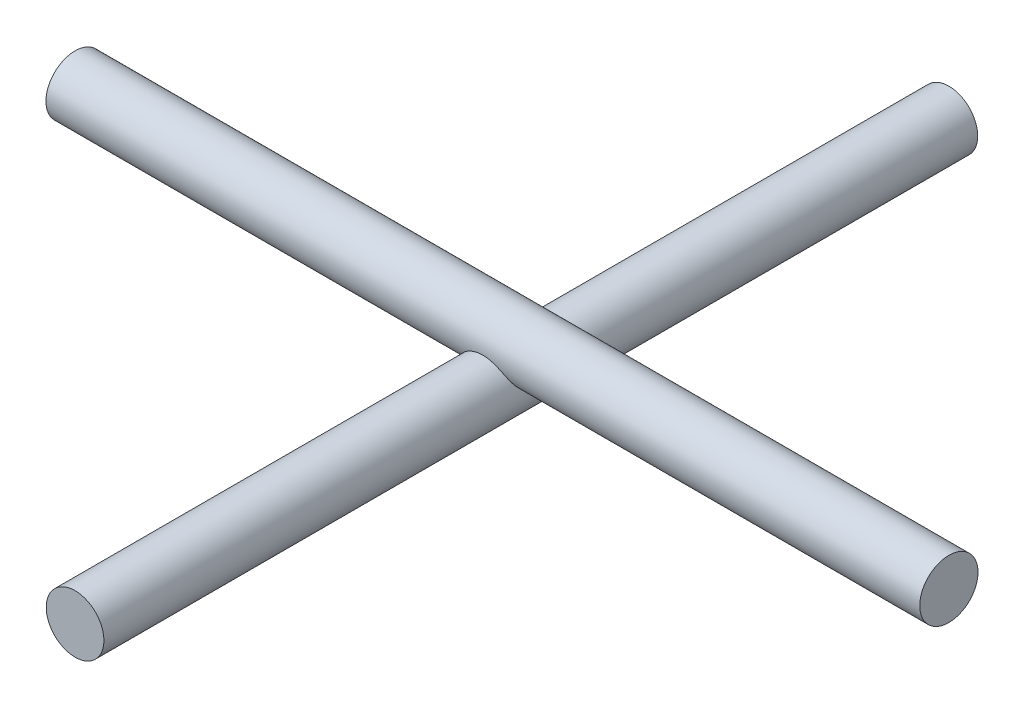
ISO-10303-21;
HEADER;
FILE_DESCRIPTION(('STEP AP214'),'2;1');
FILE_NAME('part.step','',(''),(''),'','','');
FILE_SCHEMA(('AUTOMOTIVE_DESIGN { 1 0 10303 214 1 1 1 1 }'));
ENDSEC;
DATA;
#1=APPLICATION_CONTEXT('core data for automotive mechanical design processes');
#2=APPLICATION_PROTOCOL_DEFINITION('international standard','automotive_design',2000,#1);
#3=PRODUCT_CONTEXT('',#1,'mechanical');
#4=PRODUCT('Part','Part','',(#3));
#5=PRODUCT_RELATED_PRODUCT_CATEGORY('part','',(#4));
#6=PRODUCT_DEFINITION_FORMATION('','',#4);
#7=PRODUCT_DEFINITION_CONTEXT('part definition',#1,'design');
#8=PRODUCT_DEFINITION('design','',#6,#7);
#9=PRODUCT_DEFINITION_SHAPE('','',#8);
#10=(LENGTH_UNIT() NAMED_UNIT(*) SI_UNIT(.MILLI.,.METRE.));
#11=(NAMED_UNIT(*) PLANE_ANGLE_UNIT() SI_UNIT($,.RADIAN.));
#12=(NAMED_UNIT(*) SI_UNIT($,.STERADIAN.) SOLID_ANGLE_UNIT());
#13=UNCERTAINTY_MEASURE_WITH_UNIT(LENGTH_MEASURE(1.E-05),#10,'distance_accuracy_value','');
#14=(GEOMETRIC_REPRESENTATION_CONTEXT(3) GLOBAL_UNCERTAINTY_ASSIGNED_CONTEXT((#13)) GLOBAL_UNIT_ASSIGNED_CONTEXT((#10,
#11,#12)) REPRESENTATION_CONTEXT('',''));
#15=CARTESIAN_POINT('',(0.,0.,0.));
#16=DIRECTION('',(0.,0.,1.));
#17=DIRECTION('',(1.,0.,0.));
#18=AXIS2_PLACEMENT_3D('',#15,#16,#17);
#19=CARTESIAN_POINT('',(0.,0.,-37.5));
#20=DIRECTION('',(0.,0.,1.));
#21=DIRECTION('',(1.,0.,0.));
#22=AXIS2_PLACEMENT_3D('',#19,#20,#21);
#23=CYLINDRICAL_SURFACE('',#22,2.475);
#24=CARTESIAN_POINT('',(0.,2.475,-2.49687304442977));
#25=CARTESIAN_POINT('',(-0.136825049366993,2.4749939060348,-2.49688150085582));
#26=CARTESIAN_POINT('',(-0.273836413663533,2.46360475615868,-2.49638265355391));
#27=CARTESIAN_POINT('',(-0.544283623429029,2.41831903638978,-2.49348983499042));
#28=CARTESIAN_POINT('',(-0.677710319039354,2.38436968621515,-2.49109141709474));
#29=CARTESIAN_POINT('',(-0.937213990908357,2.29478829043579,-2.48170694757631));
#30=CARTESIAN_POINT('',(-1.06328365680276,2.23913508662862,-2.47471641472239));
#31=CARTESIAN_POINT('',(-1.24360071469572,2.14097998508997,-2.4577196712458));
#32=CARTESIAN_POINT('',(-1.30225523022314,2.10580523157464,-2.45096645946464));
#33=CARTESIAN_POINT('',(-1.41618017067527,2.03093369955874,-2.43467330393503));
#34=CARTESIAN_POINT('',(-1.47145245468653,1.99123944021958,-2.42513490804704));
#35=CARTESIAN_POINT('',(-1.57584215453487,1.90959427833339,-2.40313295741082));
#36=CARTESIAN_POINT('',(-1.62512162963953,1.86781220234036,-2.39081176028972));
#37=CARTESIAN_POINT('',(-1.71968843089288,1.78112540489334,-2.36252448455092));
#38=CARTESIAN_POINT('',(-1.76497798056732,1.73622244794189,-2.34656045406855));
#39=CARTESIAN_POINT('',(-1.85117866867184,1.64400107978488,-2.31052163682664));
#40=CARTESIAN_POINT('',(-1.89209382985623,1.59668494797089,-2.2904506772387));
#41=CARTESIAN_POINT('',(-1.96929262512795,1.5004418887511,-2.24583904655907));
#42=CARTESIAN_POINT('',(-2.0055769817358,1.45151521413214,-2.22129907419797));
#43=CARTESIAN_POINT('',(-2.09833483864828,1.31657189087192,-2.14762154128585));
#44=CARTESIAN_POINT('',(-2.15000098323846,1.22977247137706,-2.09367734292665));
#45=CARTESIAN_POINT('',(-2.2390353199906,1.05908321140109,-1.97144734962398));
#46=CARTESIAN_POINT('',(-2.27640231100894,0.9751936158862,-1.90316035061641));
#47=CARTESIAN_POINT('',(-2.33723764595515,0.818361422242649,-1.75691555579531));
#48=CARTESIAN_POINT('',(-2.36125113443669,0.745097591136706,-1.67952430551205));
#49=CARTESIAN_POINT('',(-2.40017097572724,0.608179730554866,-1.51464611065477));
#50=CARTESIAN_POINT('',(-2.41507412714164,0.544529085084869,-1.42715563001109));
#51=CARTESIAN_POINT('',(-2.43950407769845,0.422740980930348,-1.23444642161153));
#52=CARTESIAN_POINT('',(-2.4483040326848,0.365879761933518,-1.12833066505226));
#53=CARTESIAN_POINT('',(-2.46095243565664,0.267919051664212,-0.908776781630666));
#54=CARTESIAN_POINT('',(-2.46479829636205,0.226827804131167,-0.79533486112155));
#55=CARTESIAN_POINT('',(-2.47026462079154,0.15745665756782,-0.54968963365143));
#56=CARTESIAN_POINT('',(-2.47156162544766,0.131313260770353,-0.416871307022782));
#57=CARTESIAN_POINT('',(-2.47299415732937,0.100781785295812,-0.148743731694326));
#58=CARTESIAN_POINT('',(-2.47312945432641,0.0963980190396963,-0.0134339945684399));
#59=CARTESIAN_POINT('',(-2.47257616638137,0.109748647278171,0.261338238199468));
#60=CARTESIAN_POINT('',(-2.47185551786278,0.128344953310946,0.400758969853668));
#61=CARTESIAN_POINT('',(-2.46798275759692,0.188668946517026,0.674623158014139));
#62=CARTESIAN_POINT('',(-2.46482965682168,0.230406040724722,0.809064566634093));
#63=CARTESIAN_POINT('',(-2.45574274550306,0.309237784754794,1.00365387422295));
#64=CARTESIAN_POINT('',(-2.45199065048915,0.338200088860001,1.06730687257856));
#65=CARTESIAN_POINT('',(-2.44246274634735,0.401276714309298,1.19183739464626));
#66=CARTESIAN_POINT('',(-2.43668790917943,0.435388556746222,1.25271623553588));
#67=CARTESIAN_POINT('',(-2.42250122616808,0.508423366981151,1.37118602236609));
#68=CARTESIAN_POINT('',(-2.41408964280531,0.547345855659373,1.42877729490057));
#69=CARTESIAN_POINT('',(-2.39397452376987,0.629522435350684,1.5401301231619));
#70=CARTESIAN_POINT('',(-2.38227299592273,0.672773874105841,1.59389398972077));
#71=CARTESIAN_POINT('',(-2.35587121661839,0.75988112335445,1.69352661037715));
#72=CARTESIAN_POINT('',(-2.3414356570802,0.803486358962307,1.73968435977016));
#73=CARTESIAN_POINT('',(-2.30866667394429,0.893289499594248,1.82786670738677));
#74=CARTESIAN_POINT('',(-2.29033551816493,0.939485884715026,1.86989368960444));
#75=CARTESIAN_POINT('',(-2.24937921196934,1.03370700478382,1.9494931564263));
#76=CARTESIAN_POINT('',(-2.22675801480763,1.08173002417984,1.9870696907146));
#77=CARTESIAN_POINT('',(-2.17695161069932,1.1787658358563,2.05759536455995));
#78=CARTESIAN_POINT('',(-2.14976704588209,1.2277784880292,2.0905451539681));
#79=CARTESIAN_POINT('',(-2.06916959171398,1.36157672084663,2.1739901506379));
#80=CARTESIAN_POINT('',(-2.01104298921558,1.44650080647529,2.21985693142635));
#81=CARTESIAN_POINT('',(-1.88113007657879,1.61184659605544,2.29825375467968));
#82=CARTESIAN_POINT('',(-1.80934072457202,1.69226729220414,2.33078082209935));
#83=CARTESIAN_POINT('',(-1.65537523159747,1.84301892664464,2.38395465374634));
#84=CARTESIAN_POINT('',(-1.57345834588338,1.9135309712599,2.40484394810856));
#85=CARTESIAN_POINT('',(-1.40001409835321,2.04386231683785,2.43828815594341));
#86=CARTESIAN_POINT('',(-1.30848326278656,2.10367773160829,2.45084004483087));
#87=CARTESIAN_POINT('',(-1.1069618627147,2.21700273782086,2.47123664430536));
#88=CARTESIAN_POINT('',(-0.996056933947301,2.26901191256973,2.47838002183871));
#89=CARTESIAN_POINT('',(-0.767611314605675,2.35613395857364,2.48846432211474));
#90=CARTESIAN_POINT('',(-0.65006751178966,2.39123883055066,2.49140325656858));
#91=CARTESIAN_POINT('',(-0.39848076111624,2.44644747548181,2.49545353316423));
#92=CARTESIAN_POINT('',(-0.264000270643142,2.46459198434734,2.49634089135644));
#93=CARTESIAN_POINT('',(0.00613414021151376,2.47868679205475,2.497064180538));
#94=CARTESIAN_POINT('',(0.141788286488773,2.47463271894238,2.49689990440957));
#95=CARTESIAN_POINT('',(0.414181223398607,2.44404710862294,2.49517974739997));
#96=CARTESIAN_POINT('',(0.550853022234931,2.41692104828272,2.49358699768031));
#97=CARTESIAN_POINT('',(0.817777126224013,2.34011074578863,2.48675226416997));
#98=CARTESIAN_POINT('',(0.948027115445714,2.29041843046641,2.48150897402558));
#99=CARTESIAN_POINT('',(1.13483449623115,2.2005738316687,2.46806525175896));
#100=CARTESIAN_POINT('',(1.19545982304176,2.16822725048849,2.46268531697002));
#101=CARTESIAN_POINT('',(1.31361253292526,2.09874543780415,2.44948935754015));
#102=CARTESIAN_POINT('',(1.37114139050164,2.06161251461753,2.44167450463329));
#103=CARTESIAN_POINT('',(1.48256428718372,1.98299672538466,2.42300145531856));
#104=CARTESIAN_POINT('',(1.53646080467559,1.9415168756939,2.4121453606064));
#105=CARTESIAN_POINT('',(1.64016390297796,1.85473857771963,2.38676089494275));
#106=CARTESIAN_POINT('',(1.68997104532823,1.80944065545852,2.37223302930806));
#107=CARTESIAN_POINT('',(1.78083430256718,1.71987155320211,2.34039062991054));
#108=CARTESIAN_POINT('',(1.82227479436775,1.67586256781319,2.32343518009209));
#109=CARTESIAN_POINT('',(1.90107032775758,1.58591625700247,2.28561013089839));
#110=CARTESIAN_POINT('',(1.93842599004319,1.53997922602233,2.26474112750587));
#111=CARTESIAN_POINT('',(2.00881592419877,1.4469558712191,2.21882260504872));
#112=CARTESIAN_POINT('',(2.0418535733415,1.39987048019112,2.19377638845705));
#113=CARTESIAN_POINT('',(2.10353879894642,1.30535078230881,2.13936093340693));
#114=CARTESIAN_POINT('',(2.13218679642165,1.25791650937377,2.10999211006161));
#115=CARTESIAN_POINT('',(2.20508522502552,1.12791781377905,2.02307677920414));
#116=CARTESIAN_POINT('',(2.24483769306437,1.04579990162751,1.96096656653636));
#117=CARTESIAN_POINT('',(2.31209183841771,0.887304666117711,1.82418788888984));
#118=CARTESIAN_POINT('',(2.33958983072755,0.810929075246357,1.74951565571141));
#119=CARTESIAN_POINT('',(2.3849027711362,0.666119062353311,1.58809308634355));
#120=CARTESIAN_POINT('',(2.40256407931124,0.597823093891606,1.50117631781898));
#121=CARTESIAN_POINT('',(2.43024482922206,0.472904729325865,1.31824052068492));
#122=CARTESIAN_POINT('',(2.44026097630848,0.416287373731096,1.22221758783022));
#123=CARTESIAN_POINT('',(2.45620158853844,0.309798395278112,1.01033594174903));
#124=CARTESIAN_POINT('',(2.46143296671773,0.26173460465799,0.893515285062469));
#125=CARTESIAN_POINT('',(2.46848196006817,0.183730118803632,0.653867770940564));
#126=CARTESIAN_POINT('',(2.47029812085328,0.153797148339215,0.531038377491818));
#127=CARTESIAN_POINT('',(2.47262264807634,0.110857021515243,0.270522492307618));
#128=CARTESIAN_POINT('',(2.47299197877432,0.099706138028674,0.13252503097438));
#129=CARTESIAN_POINT('',(2.47296548490606,0.10030577430031,-0.143439482061801));
#130=CARTESIAN_POINT('',(2.47256949554365,0.112061226478373,-0.281406520815977));
#131=CARTESIAN_POINT('',(2.47002843327228,0.158541559506987,-0.55588034950008));
#132=CARTESIAN_POINT('',(2.46785288094416,0.193664697726473,-0.692319362644552));
#133=CARTESIAN_POINT('',(2.45882024239123,0.28632689822146,-0.957383834309766));
#134=CARTESIAN_POINT('',(2.45196177415532,0.343872575630785,-1.08600697402212));
#135=CARTESIAN_POINT('',(2.43493080200472,0.444815287350936,-1.26884094315821));
#136=CARTESIAN_POINT('',(2.42820427975245,0.480581556043664,-1.32770106724542));
#137=CARTESIAN_POINT('',(2.41190767221583,0.556634087291699,-1.4419968245547));
#138=CARTESIAN_POINT('',(2.40233905487687,0.596918009804208,-1.4974342078157));
#139=CARTESIAN_POINT('',(2.37973298849832,0.681474331232718,-1.6043384093918));
#140=CARTESIAN_POINT('',(2.36669891208633,0.72574282475544,-1.65580902572857));
#141=CARTESIAN_POINT('',(2.33653777657943,0.817651050037594,-1.75435690077107));
#142=CARTESIAN_POINT('',(2.31941140092718,0.865290217936651,-1.80143489125256));
#143=CARTESIAN_POINT('',(2.28261122627155,0.957871811493512,-1.88597820755859));
#144=CARTESIAN_POINT('',(2.26340810574185,1.00255492168238,-1.92393293718533));
#145=CARTESIAN_POINT('',(2.22101026925715,1.09327232316261,-1.99577515230018));
#146=CARTESIAN_POINT('',(2.1978161129221,1.13930642426947,-2.02966320688507));
#147=CARTESIAN_POINT('',(2.14725429826252,1.23195128551939,-2.09322619952134));
#148=CARTESIAN_POINT('',(2.11988884053493,1.27856172976445,-2.12290334321891));
#149=CARTESIAN_POINT('',(2.06093378528919,1.3715745253684,-2.17804944453503));
#150=CARTESIAN_POINT('',(2.0293444827235,1.41797689102385,-2.2035186957147));
#151=CARTESIAN_POINT('',(1.93604311053365,1.54514253522769,-2.26838395461814));
#152=CARTESIAN_POINT('',(1.86983997936213,1.62490351246119,-2.30343814951185));
#153=CARTESIAN_POINT('',(1.72553795785078,1.77741297814762,-2.36221657585239));
#154=CARTESIAN_POINT('',(1.64743648032212,1.85015993583364,-2.38593833851243));
#155=CARTESIAN_POINT('',(1.47799749415961,1.98835264325932,-2.42512803154314));
#156=CARTESIAN_POINT('',(1.38627063425182,2.05341737288299,-2.44024921662539));
#157=CARTESIAN_POINT('',(1.19414324325638,2.17079430049523,-2.46361019818627));
#158=CARTESIAN_POINT('',(1.09373501185821,2.22309501644008,-2.47184381490063));
#159=CARTESIAN_POINT('',(0.873142699595812,2.31938275986885,-2.48473792104259));
#160=CARTESIAN_POINT('',(0.752077430529493,2.36143054053586,-2.48880139041796));
#161=CARTESIAN_POINT('',(0.505005590795479,2.42628732440213,-2.49417195915683));
#162=CARTESIAN_POINT('',(0.379007323909745,2.44912731655081,-2.49548350347949));
#163=CARTESIAN_POINT('',(0.210251100162534,2.46641410248409,-2.49643005359974));
#164=CARTESIAN_POINT('',(0.168269001642329,2.46963182173397,-2.49659960093789));
#165=CARTESIAN_POINT('',(0.0841971491436473,2.47392568705195,-2.49681979396259));
#166=CARTESIAN_POINT('',(0.0421073973067279,2.475001875395,-2.49687044199628));
#167=CARTESIAN_POINT('',(0.,2.475,-2.49687304442977));
#168=B_SPLINE_CURVE_WITH_KNOTS('',3,(#24,#25,#26,#27,#28,#29,#30,#31,#32,#33,#34,#35,#36,#37,
#38,#39,#40,#41,#42,#43,#44,#45,#46,#47,#48,#49,#50,#51,#52,#53,#54,#55,#56,#57,#58,#59,#60,#61,
#62,#63,#64,#65,#66,#67,#68,#69,#70,#71,#72,#73,#74,#75,#76,#77,#78,#79,#80,#81,#82,#83,#84,#85,
#86,#87,#88,#89,#90,#91,#92,#93,#94,#95,#96,#97,#98,#99,#100,#101,#102,#103,#104,#105,#106,#107,
#108,#109,#110,#111,#112,#113,#114,#115,#116,#117,#118,#119,#120,#121,#122,#123,#124,#125,#126,
#127,#128,#129,#130,#131,#132,#133,#134,#135,#136,#137,#138,#139,#140,#141,#142,#143,#144,#145,
#146,#147,#148,#149,#150,#151,#152,#153,#154,#155,#156,#157,#158,#159,#160,#161,#162,#163,#164,
#165,#166,#167),.UNSPECIFIED.,.T.,.F.,(4,2,2,2,2,2,2,2,2,2,2,2,2,2,2,2,2,2,2,2,2,2,2,2,2,2,2,2,
2,2,2,2,2,2,2,2,2,2,2,2,2,2,2,2,2,2,2,2,2,2,2,2,2,2,2,2,2,2,2,2,2,2,2,2,2,2,2,2,2,2,2,4),(0.,
0.410318094594394,0.821599536569382,1.23328292636588,1.43922639549971,1.6450556290929,
1.84209253766373,2.03901893658274,2.23576265240208,2.43247563368976,2.77403728799959,
3.11562762754519,3.44199616833186,3.76847932998998,4.12916719204974,4.49004334739455,
4.89434277350771,5.29872232229216,5.71874007299714,6.13892869175584,6.34880457258748,
6.55857974273748,6.76833403698835,6.97796059678972,7.17302902015875,7.3679841941605,
7.56276058314146,7.75750958731201,8.09364223294508,8.42984980273072,8.75876024787065,
9.08778994775097,9.45439814416519,9.82117965302211,10.2264259551259,10.6317520723282,
11.0478505983979,11.4640981028018,11.6706468605116,11.8770963757078,12.0834035713332,
12.2896823899764,12.4777564646131,12.6658019212665,12.8536994092867,13.0415788646971,
13.3709514892251,13.7004230916325,14.0349059359102,14.3695328428777,14.7472554853076,
15.125138946267,15.5385561628165,15.9520624103074,16.3728030461027,16.7936679035795,
17.00103940868,17.2083039918612,17.4153675962841,17.6223966437734,17.8072061843328,
17.9919898321264,18.1766763313652,18.3613499406146,18.6879641301169,19.0146494405831,
19.3537112773832,19.6930770068665,20.0761655674937,20.4586348787075,20.5849112307862,
20.711185090077),.UNSPECIFIED.);
#169=CARTESIAN_POINT('',(0.,2.475,-2.49687304442977));
#170=VERTEX_POINT('',#169);
#171=EDGE_CURVE('E10',#170,#170,#168,.T.);
#172=ORIENTED_EDGE('',*,*,#171,.F.);
#173=EDGE_LOOP('',(#172));
#174=FACE_BOUND('',#173,.T.);
#175=CARTESIAN_POINT('',(0.,0.,-37.5));
#176=DIRECTION('',(0.,0.,1.));
#177=DIRECTION('',(1.,0.,0.));
#178=AXIS2_PLACEMENT_3D('',#175,#176,#177);
#179=CIRCLE('',#178,2.475);
#180=CARTESIAN_POINT('',(2.475,0.,-37.5));
#181=VERTEX_POINT('',#180);
#182=EDGE_CURVE('E42',#181,#181,#179,.T.);
#183=ORIENTED_EDGE('',*,*,#182,.T.);
#184=EDGE_LOOP('',(#183));
#185=FACE_BOUND('',#184,.T.);
#186=CARTESIAN_POINT('',(0.,0.,37.5));
#187=DIRECTION('',(0.,0.,1.));
#188=DIRECTION('',(1.,0.,0.));
#189=AXIS2_PLACEMENT_3D('',#186,#187,#188);
#190=CIRCLE('',#189,2.475);
#191=CARTESIAN_POINT('',(2.475,0.,37.5));
#192=VERTEX_POINT('',#191);
#193=EDGE_CURVE('E46',#192,#192,#190,.T.);
#194=ORIENTED_EDGE('',*,*,#193,.F.);
#195=EDGE_LOOP('',(#194));
#196=FACE_BOUND('',#195,.T.);
#197=ADVANCED_FACE('F31',(#174,#185,#196),#23,.T.);
#198=CARTESIAN_POINT('',(0.,0.,-37.5));
#199=DIRECTION('',(0.,0.,1.));
#200=DIRECTION('',(1.,0.,0.));
#201=AXIS2_PLACEMENT_3D('',#198,#199,#200);
#202=PLANE('',#201);
#203=ORIENTED_EDGE('',*,*,#182,.F.);
#204=EDGE_LOOP('',(#203));
#205=FACE_BOUND('',#204,.T.);
#206=ADVANCED_FACE('F71',(#205),#202,.F.);
#207=CARTESIAN_POINT('',(0.,0.,37.5));
#208=DIRECTION('',(0.,0.,1.));
#209=DIRECTION('',(1.,0.,0.));
#210=AXIS2_PLACEMENT_3D('',#207,#208,#209);
#211=PLANE('',#210);
#212=ORIENTED_EDGE('',*,*,#193,.T.);
#213=EDGE_LOOP('',(#212));
#214=FACE_BOUND('',#213,.T.);
#215=ADVANCED_FACE('F64',(#214),#211,.T.);
#216=CARTESIAN_POINT('',(-37.5,2.6,0.));
#217=DIRECTION('',(1.,0.,0.));
#218=DIRECTION('',(0.,0.,-1.));
#219=AXIS2_PLACEMENT_3D('',#216,#217,#218);
#220=CYLINDRICAL_SURFACE('',#219,2.5);
#221=ORIENTED_EDGE('',*,*,#171,.T.);
#222=EDGE_LOOP('',(#221));
#223=FACE_BOUND('',#222,.T.);
#224=CARTESIAN_POINT('',(-37.5,2.6,0.));
#225=DIRECTION('',(1.,0.,0.));
#226=DIRECTION('',(0.,0.,-1.));
#227=AXIS2_PLACEMENT_3D('',#224,#225,#226);
#228=CIRCLE('',#227,2.5);
#229=CARTESIAN_POINT('',(-37.5,2.6,-2.5));
#230=VERTEX_POINT('',#229);
#231=EDGE_CURVE('E50',#230,#230,#228,.T.);
#232=ORIENTED_EDGE('',*,*,#231,.T.);
#233=EDGE_LOOP('',(#232));
#234=FACE_BOUND('',#233,.T.);
#235=CARTESIAN_POINT('',(37.5,2.6,0.));
#236=DIRECTION('',(1.,0.,0.));
#237=DIRECTION('',(0.,0.,-1.));
#238=AXIS2_PLACEMENT_3D('',#235,#236,#237);
#239=CIRCLE('',#238,2.5);
#240=CARTESIAN_POINT('',(37.5,2.6,-2.5));
#241=VERTEX_POINT('',#240);
#242=EDGE_CURVE('E55',#241,#241,#239,.T.);
#243=ORIENTED_EDGE('',*,*,#242,.F.);
#244=EDGE_LOOP('',(#243));
#245=FACE_BOUND('',#244,.T.);
#246=ADVANCED_FACE('F61',(#223,#234,#245),#220,.T.);
#247=CARTESIAN_POINT('',(-37.5,2.6,0.));
#248=DIRECTION('',(1.,0.,0.));
#249=DIRECTION('',(0.,0.,-1.));
#250=AXIS2_PLACEMENT_3D('',#247,#248,#249);
#251=PLANE('',#250);
#252=ORIENTED_EDGE('',*,*,#231,.F.);
#253=EDGE_LOOP('',(#252));
#254=FACE_BOUND('',#253,.T.);
#255=ADVANCED_FACE('F63',(#254),#251,.F.);
#256=CARTESIAN_POINT('',(37.5,2.6,0.));
#257=DIRECTION('',(1.,0.,0.));
#258=DIRECTION('',(0.,0.,-1.));
#259=AXIS2_PLACEMENT_3D('',#256,#257,#258);
#260=PLANE('',#259);
#261=ORIENTED_EDGE('',*,*,#242,.T.);
#262=EDGE_LOOP('',(#261));
#263=FACE_BOUND('',#262,.T.);
#264=ADVANCED_FACE('F59',(#263),#260,.T.);
#265=CLOSED_SHELL('',(#197,#206,#215,#246,#255,#264));
#266=MANIFOLD_SOLID_BREP('B2',#265);
#267=ADVANCED_BREP_SHAPE_REPRESENTATION('',(#18,#266),#14);
#268=SHAPE_DEFINITION_REPRESENTATION(#9,#267);
ENDSEC;
END-ISO-10303-21;
